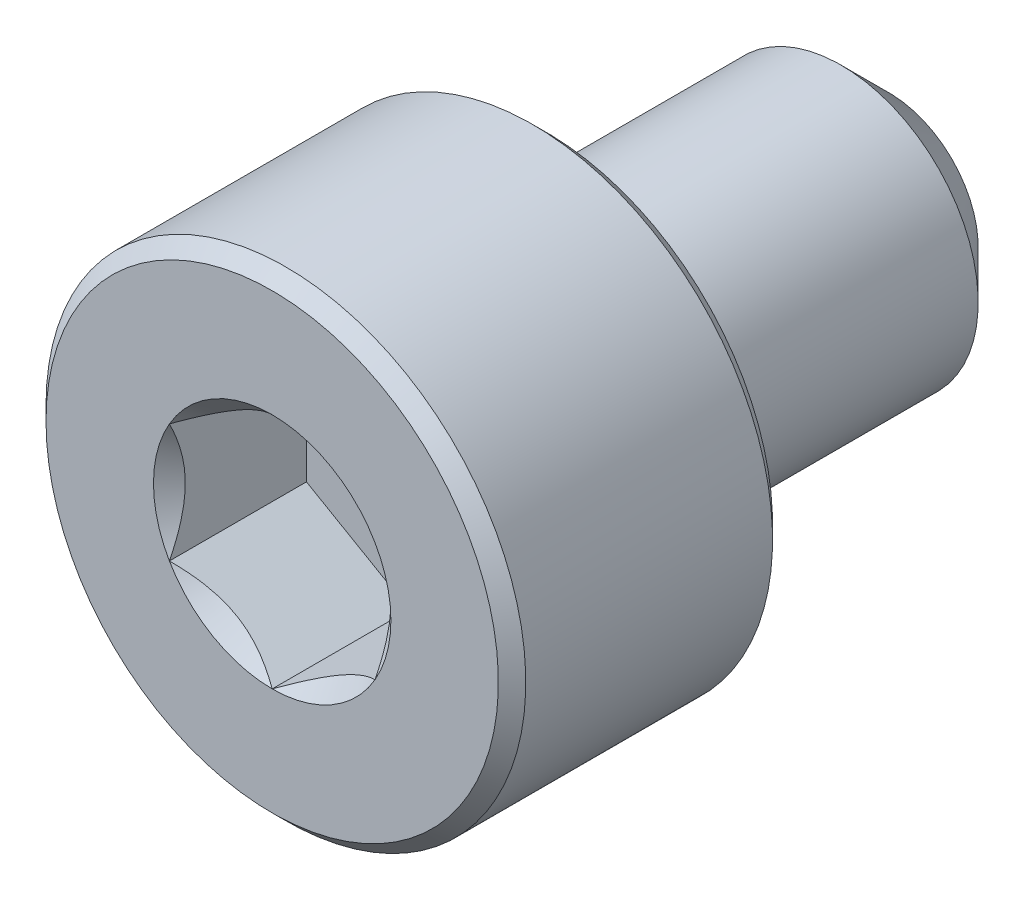
ISO-10303-21;
HEADER;
FILE_DESCRIPTION(('STEP AP214'),'2;1');
FILE_NAME('part.step','',(''),(''),'','','');
FILE_SCHEMA(('AUTOMOTIVE_DESIGN { 1 0 10303 214 1 1 1 1 }'));
ENDSEC;
DATA;
#1=APPLICATION_CONTEXT('core data for automotive mechanical design processes');
#2=APPLICATION_PROTOCOL_DEFINITION('international standard','automotive_design',2000,#1);
#3=PRODUCT_CONTEXT('',#1,'mechanical');
#4=PRODUCT('Part','Part','',(#3));
#5=PRODUCT_RELATED_PRODUCT_CATEGORY('part','',(#4));
#6=PRODUCT_DEFINITION_FORMATION('','',#4);
#7=PRODUCT_DEFINITION_CONTEXT('part definition',#1,'design');
#8=PRODUCT_DEFINITION('design','',#6,#7);
#9=PRODUCT_DEFINITION_SHAPE('','',#8);
#10=(LENGTH_UNIT() NAMED_UNIT(*) SI_UNIT(.MILLI.,.METRE.));
#11=(NAMED_UNIT(*) PLANE_ANGLE_UNIT() SI_UNIT($,.RADIAN.));
#12=(NAMED_UNIT(*) SI_UNIT($,.STERADIAN.) SOLID_ANGLE_UNIT());
#13=UNCERTAINTY_MEASURE_WITH_UNIT(LENGTH_MEASURE(1.E-05),#10,'distance_accuracy_value','');
#14=(GEOMETRIC_REPRESENTATION_CONTEXT(3) GLOBAL_UNCERTAINTY_ASSIGNED_CONTEXT((#13)) GLOBAL_UNIT_ASSIGNED_CONTEXT((#10,
#11,#12)) REPRESENTATION_CONTEXT('',''));
#15=CARTESIAN_POINT('',(0.,0.,0.));
#16=DIRECTION('',(0.,0.,1.));
#17=DIRECTION('',(1.,0.,0.));
#18=AXIS2_PLACEMENT_3D('',#15,#16,#17);
#19=CARTESIAN_POINT('',(0.,3.3,4.5));
#20=DIRECTION('',(0.,0.,1.));
#21=DIRECTION('',(1.,0.,0.));
#22=AXIS2_PLACEMENT_3D('',#19,#20,#21);
#23=PLANE('',#22);
#24=CARTESIAN_POINT('',(0.,0.,4.5));
#25=DIRECTION('',(0.,0.,1.));
#26=DIRECTION('',(1.,0.,0.));
#27=AXIS2_PLACEMENT_3D('',#24,#25,#26);
#28=CIRCLE('',#27,1.73205080756888);
#29=CARTESIAN_POINT('',(1.5,0.86602540378444,4.5));
#30=VERTEX_POINT('',#29);
#31=CARTESIAN_POINT('',(0.,1.73205080756888,4.5));
#32=VERTEX_POINT('',#31);
#33=EDGE_CURVE('E102',#30,#32,#28,.T.);
#34=ORIENTED_EDGE('',*,*,#33,.F.);
#35=CARTESIAN_POINT('',(1.5,-0.86602540378444,4.5));
#36=VERTEX_POINT('',#35);
#37=EDGE_CURVE('E62',#36,#30,#28,.T.);
#38=ORIENTED_EDGE('',*,*,#37,.F.);
#39=CARTESIAN_POINT('',(0.,-1.73205080756888,4.5));
#40=VERTEX_POINT('',#39);
#41=EDGE_CURVE('E288',#40,#36,#28,.T.);
#42=ORIENTED_EDGE('',*,*,#41,.F.);
#43=CARTESIAN_POINT('',(-1.5,-0.866025403784437,4.5));
#44=VERTEX_POINT('',#43);
#45=EDGE_CURVE('E69',#44,#40,#28,.T.);
#46=ORIENTED_EDGE('',*,*,#45,.F.);
#47=CARTESIAN_POINT('',(-1.5,0.86602540378444,4.5));
#48=VERTEX_POINT('',#47);
#49=EDGE_CURVE('E138',#48,#44,#28,.T.);
#50=ORIENTED_EDGE('',*,*,#49,.F.);
#51=EDGE_CURVE('E111',#32,#48,#28,.T.);
#52=ORIENTED_EDGE('',*,*,#51,.F.);
#53=EDGE_LOOP('',(#34,#38,#42,#46,#50,#52));
#54=FACE_BOUND('',#53,.T.);
#55=CARTESIAN_POINT('',(0.,0.,4.5));
#56=DIRECTION('',(0.,0.,-1.));
#57=DIRECTION('',(-1.,0.,0.));
#58=AXIS2_PLACEMENT_3D('',#55,#56,#57);
#59=CIRCLE('',#58,3.3);
#60=CARTESIAN_POINT('',(-3.3,0.,4.5));
#61=VERTEX_POINT('',#60);
#62=EDGE_CURVE('E56',#61,#61,#59,.T.);
#63=ORIENTED_EDGE('',*,*,#62,.F.);
#64=EDGE_LOOP('',(#63));
#65=FACE_BOUND('',#64,.T.);
#66=ADVANCED_FACE('F43',(#54,#65),#23,.T.);
#67=CARTESIAN_POINT('',(0.,0.,4.3));
#68=DIRECTION('',(0.,0.,-1.));
#69=DIRECTION('',(-1.,0.,0.));
#70=AXIS2_PLACEMENT_3D('',#67,#68,#69);
#71=CONICAL_SURFACE('',#70,3.5,0.785398163397452);
#72=ORIENTED_EDGE('',*,*,#62,.T.);
#73=EDGE_LOOP('',(#72));
#74=FACE_BOUND('',#73,.T.);
#75=CARTESIAN_POINT('',(0.,0.,4.3));
#76=DIRECTION('',(0.,0.,-1.));
#77=DIRECTION('',(-1.,0.,0.));
#78=AXIS2_PLACEMENT_3D('',#75,#76,#77);
#79=CIRCLE('',#78,3.5);
#80=CARTESIAN_POINT('',(-3.5,0.,4.3));
#81=VERTEX_POINT('',#80);
#82=EDGE_CURVE('E222',#81,#81,#79,.T.);
#83=ORIENTED_EDGE('',*,*,#82,.F.);
#84=EDGE_LOOP('',(#83));
#85=FACE_BOUND('',#84,.T.);
#86=ADVANCED_FACE('F227',(#74,#85),#71,.T.);
#87=CARTESIAN_POINT('',(0.,0.,-4.5));
#88=DIRECTION('',(0.,0.,-1.));
#89=DIRECTION('',(-1.,0.,0.));
#90=AXIS2_PLACEMENT_3D('',#87,#88,#89);
#91=CYLINDRICAL_SURFACE('',#90,3.5);
#92=ORIENTED_EDGE('',*,*,#82,.T.);
#93=EDGE_LOOP('',(#92));
#94=FACE_BOUND('',#93,.T.);
#95=CARTESIAN_POINT('',(0.,0.,0.700000000000001));
#96=DIRECTION('',(0.,0.,-1.));
#97=DIRECTION('',(-1.,0.,0.));
#98=AXIS2_PLACEMENT_3D('',#95,#96,#97);
#99=CIRCLE('',#98,3.5);
#100=CARTESIAN_POINT('',(-3.5,0.,0.700000000000001));
#101=VERTEX_POINT('',#100);
#102=EDGE_CURVE('E219',#101,#101,#99,.T.);
#103=ORIENTED_EDGE('',*,*,#102,.F.);
#104=EDGE_LOOP('',(#103));
#105=FACE_BOUND('',#104,.T.);
#106=ADVANCED_FACE('F235',(#94,#105),#91,.T.);
#107=CARTESIAN_POINT('',(0.,0.,0.5));
#108=DIRECTION('',(0.,0.,1.));
#109=DIRECTION('',(1.,0.,0.));
#110=AXIS2_PLACEMENT_3D('',#107,#108,#109);
#111=CONICAL_SURFACE('',#110,3.3,0.785398163397448);
#112=ORIENTED_EDGE('',*,*,#102,.T.);
#113=EDGE_LOOP('',(#112));
#114=FACE_BOUND('',#113,.T.);
#115=CARTESIAN_POINT('',(0.,0.,0.5));
#116=DIRECTION('',(0.,0.,-1.));
#117=DIRECTION('',(-1.,0.,0.));
#118=AXIS2_PLACEMENT_3D('',#115,#116,#117);
#119=CIRCLE('',#118,3.3);
#120=CARTESIAN_POINT('',(-3.3,0.,0.5));
#121=VERTEX_POINT('',#120);
#122=EDGE_CURVE('E216',#121,#121,#119,.T.);
#123=ORIENTED_EDGE('',*,*,#122,.F.);
#124=EDGE_LOOP('',(#123));
#125=FACE_BOUND('',#124,.T.);
#126=ADVANCED_FACE('F239',(#114,#125),#111,.T.);
#127=CARTESIAN_POINT('',(0.,3.3,0.5));
#128=DIRECTION('',(0.,0.,-1.));
#129=DIRECTION('',(-1.,0.,0.));
#130=AXIS2_PLACEMENT_3D('',#127,#128,#129);
#131=PLANE('',#130);
#132=ORIENTED_EDGE('',*,*,#122,.T.);
#133=EDGE_LOOP('',(#132));
#134=FACE_BOUND('',#133,.T.);
#135=CARTESIAN_POINT('',(0.,0.,0.5));
#136=DIRECTION('',(0.,0.,-1.));
#137=DIRECTION('',(-1.,0.,0.));
#138=AXIS2_PLACEMENT_3D('',#135,#136,#137);
#139=CIRCLE('',#138,2.);
#140=CARTESIAN_POINT('',(-2.,0.,0.5));
#141=VERTEX_POINT('',#140);
#142=EDGE_CURVE('E213',#141,#141,#139,.T.);
#143=ORIENTED_EDGE('',*,*,#142,.F.);
#144=EDGE_LOOP('',(#143));
#145=FACE_BOUND('',#144,.T.);
#146=ADVANCED_FACE('F245',(#134,#145),#131,.T.);
#147=CARTESIAN_POINT('',(0.,0.,-4.5));
#148=DIRECTION('',(0.,0.,-1.));
#149=DIRECTION('',(-1.,0.,0.));
#150=AXIS2_PLACEMENT_3D('',#147,#148,#149);
#151=CYLINDRICAL_SURFACE('',#150,2.);
#152=ORIENTED_EDGE('',*,*,#142,.T.);
#153=EDGE_LOOP('',(#152));
#154=FACE_BOUND('',#153,.T.);
#155=CARTESIAN_POINT('',(0.,0.,-3.79999999999999));
#156=DIRECTION('',(0.,0.,-1.));
#157=DIRECTION('',(-1.,0.,0.));
#158=AXIS2_PLACEMENT_3D('',#155,#156,#157);
#159=CIRCLE('',#158,2.);
#160=CARTESIAN_POINT('',(-2.,0.,-3.79999999999999));
#161=VERTEX_POINT('',#160);
#162=EDGE_CURVE('E210',#161,#161,#159,.T.);
#163=ORIENTED_EDGE('',*,*,#162,.F.);
#164=EDGE_LOOP('',(#163));
#165=FACE_BOUND('',#164,.T.);
#166=ADVANCED_FACE('F249',(#154,#165),#151,.T.);
#167=CARTESIAN_POINT('',(0.,0.,-4.5));
#168=DIRECTION('',(0.,0.,1.));
#169=DIRECTION('',(1.,0.,0.));
#170=AXIS2_PLACEMENT_3D('',#167,#168,#169);
#171=CONICAL_SURFACE('',#170,1.3,0.785398163397443);
#172=ORIENTED_EDGE('',*,*,#162,.T.);
#173=EDGE_LOOP('',(#172));
#174=FACE_BOUND('',#173,.T.);
#175=CARTESIAN_POINT('',(0.,0.,-4.5));
#176=DIRECTION('',(0.,0.,-1.));
#177=DIRECTION('',(-1.,0.,0.));
#178=AXIS2_PLACEMENT_3D('',#175,#176,#177);
#179=CIRCLE('',#178,1.3);
#180=CARTESIAN_POINT('',(-1.3,0.,-4.5));
#181=VERTEX_POINT('',#180);
#182=EDGE_CURVE('E198',#181,#181,#179,.T.);
#183=ORIENTED_EDGE('',*,*,#182,.F.);
#184=EDGE_LOOP('',(#183));
#185=FACE_BOUND('',#184,.T.);
#186=ADVANCED_FACE('F252',(#174,#185),#171,.T.);
#187=CARTESIAN_POINT('',(0.,1.3,-4.5));
#188=DIRECTION('',(0.,0.,-1.));
#189=DIRECTION('',(-1.,0.,0.));
#190=AXIS2_PLACEMENT_3D('',#187,#188,#189);
#191=PLANE('',#190);
#192=ORIENTED_EDGE('',*,*,#182,.T.);
#193=EDGE_LOOP('',(#192));
#194=FACE_BOUND('',#193,.T.);
#195=ADVANCED_FACE('F171',(#194),#191,.T.);
#196=CARTESIAN_POINT('',(0.,0.,4.5));
#197=DIRECTION('',(0.,0.,1.));
#198=DIRECTION('',(1.,0.,0.));
#199=AXIS2_PLACEMENT_3D('',#196,#197,#198);
#200=CONICAL_SURFACE('',#199,1.73205080756888,0.78539816339745);
#201=ORIENTED_EDGE('',*,*,#51,.T.);
#202=CARTESIAN_POINT('',(0.000200000000000415,1.73216627762272,4.50011548160007));
#203=CARTESIAN_POINT('',(-0.0513677907370752,1.70239359975915,4.47036547606733));
#204=CARTESIAN_POINT('',(-0.1037979176652,1.67212305186355,4.44236248391031));
#205=CARTESIAN_POINT('',(-0.210709034055596,1.61039789003619,4.39108923044014));
#206=CARTESIAN_POINT('',(-0.265200195814661,1.57893740312614,4.36784750504437));
#207=CARTESIAN_POINT('',(-0.375079081357248,1.51549879897987,4.32803372899222));
#208=CARTESIAN_POINT('',(-0.430438809095199,1.4835368452681,4.3113615856709));
#209=CARTESIAN_POINT('',(-0.54237725747715,1.41890915196211,4.2856744568181));
#210=CARTESIAN_POINT('',(-0.598952556553008,1.38624538781118,4.27664029047887));
#211=CARTESIAN_POINT('',(-0.69645538951644,1.329952100953,4.26848908122685));
#212=CARTESIAN_POINT('',(-0.737256908280466,1.30639533311124,4.26728225298922));
#213=CARTESIAN_POINT('',(-0.818787969615858,1.25932335290193,4.26931405716227));
#214=CARTESIAN_POINT('',(-0.85951749431463,1.23580815085313,4.27255367074831));
#215=CARTESIAN_POINT('',(-0.940584402163416,1.18900414978427,4.28329198598196));
#216=CARTESIAN_POINT('',(-0.980921384598288,1.1657155821172,4.29079465301873));
#217=CARTESIAN_POINT('',(-1.06091833691403,1.11952932016335,4.30965161192829));
#218=CARTESIAN_POINT('',(-1.10057800851621,1.09663179808786,4.32100755701859));
#219=CARTESIAN_POINT('',(-1.20216313477448,1.03798159809698,4.35472164759267));
#220=CARTESIAN_POINT('',(-1.26345855370969,1.00259267147465,4.37962184909337));
#221=CARTESIAN_POINT('',(-1.35358562846331,0.950557780604375,4.42165665327158));
#222=CARTESIAN_POINT('',(-1.38328513990772,0.933410759677148,4.4364251535591));
#223=CARTESIAN_POINT('',(-1.44213790138375,0.899432101996407,4.46731056594017));
#224=CARTESIAN_POINT('',(-1.47129140422064,0.88260031928571,4.48342683412171));
#225=CARTESIAN_POINT('',(-1.5002,0.865909933730601,4.50011548160007));
#226=B_SPLINE_CURVE_WITH_KNOTS('',3,(#202,#203,#204,#205,#206,#207,#208,#209,#210,#211,#212,
#213,#214,#215,#216,#217,#218,#219,#220,#221,#222,#223,#224,#225),.UNSPECIFIED.,.F.,.F.,(4,2,2,
2,2,2,2,2,2,2,2,4),(0.,0.199829143693305,0.400822987382389,0.598623720538181,0.795926240188889,
0.937113067959881,1.07833105577193,1.21968061668222,1.36109089931054,1.58570969637565,
1.69770705470964,1.80965120737194),.UNSPECIFIED.);
#227=EDGE_CURVE('E11',#32,#48,#226,.T.);
#228=ORIENTED_EDGE('',*,*,#227,.F.);
#229=EDGE_LOOP('',(#201,#228));
#230=FACE_BOUND('',#229,.T.);
#231=ADVANCED_FACE('F115',(#230),#200,.F.);
#232=ORIENTED_EDGE('',*,*,#49,.T.);
#233=CARTESIAN_POINT('',(-1.5,-1.70094076570699,5.03581150933748));
#234=CARTESIAN_POINT('',(-1.5,-1.65940339844307,5.00466245356307));
#235=CARTESIAN_POINT('',(-1.5,-1.61763176138548,4.97382664603814));
#236=CARTESIAN_POINT('',(-1.5,-1.53352581710889,4.91291005817041));
#237=CARTESIAN_POINT('',(-1.5,-1.49119136858461,4.88282947313436));
#238=CARTESIAN_POINT('',(-1.5,-1.36258344501966,4.79348482963313));
#239=CARTESIAN_POINT('',(-1.5,-1.27533705988673,4.73559781348778));
#240=CARTESIAN_POINT('',(-1.5,-1.09255216894207,4.62219567429685));
#241=CARTESIAN_POINT('',(-1.5,-0.996821581803492,4.56698654757307));
#242=CARTESIAN_POINT('',(-1.5,-0.800613082291591,4.4661637894456));
#243=CARTESIAN_POINT('',(-1.5,-0.700152604862087,4.42051785177961));
#244=CARTESIAN_POINT('',(-1.5,-0.549105960820994,4.36468252969871));
#245=CARTESIAN_POINT('',(-1.5,-0.50070074362804,4.34861439232622));
#246=CARTESIAN_POINT('',(-1.5,-0.40274469507941,4.32036772251469));
#247=CARTESIAN_POINT('',(-1.5,-0.353193782853662,4.30818946555124));
#248=CARTESIAN_POINT('',(-1.5,-0.254057869430008,4.28855091399036));
#249=CARTESIAN_POINT('',(-1.5,-0.204488814603775,4.28101136158588));
#250=CARTESIAN_POINT('',(-1.5,-0.104849462627796,4.27079321692886));
#251=CARTESIAN_POINT('',(-1.5,-0.054779247575758,4.26811384119743));
#252=CARTESIAN_POINT('',(-1.5,0.043673722908844,4.26780462686181));
#253=CARTESIAN_POINT('',(-1.5,0.0920560164094804,4.27000633072589));
#254=CARTESIAN_POINT('',(-1.5,0.188397733218518,4.27897258823616));
#255=CARTESIAN_POINT('',(-1.5,0.236357072029982,4.28573803359405));
#256=CARTESIAN_POINT('',(-1.5,0.332310053939587,4.30358163901288));
#257=CARTESIAN_POINT('',(-1.5,0.380290051019947,4.31473209678684));
#258=CARTESIAN_POINT('',(-1.5,0.475204866701384,4.34076106187732));
#259=CARTESIAN_POINT('',(-1.5,0.52213978119671,4.35563922560084));
#260=CARTESIAN_POINT('',(-1.5,0.671135849237721,4.40843439268167));
#261=CARTESIAN_POINT('',(-1.5,0.771043708402958,4.45241449643641));
#262=CARTESIAN_POINT('',(-1.5,0.96615432077171,4.55016194816059));
#263=CARTESIAN_POINT('',(-1.5,1.06133841027248,4.60396471049644));
#264=CARTESIAN_POINT('',(-1.5,1.24322962123133,4.71492426634355));
#265=CARTESIAN_POINT('',(-1.5,1.33012275327054,4.77177988846287));
#266=CARTESIAN_POINT('',(-1.5,1.45814294533514,4.85965573982338));
#267=CARTESIAN_POINT('',(-1.5,1.50026316125082,4.88925424362582));
#268=CARTESIAN_POINT('',(-1.5,1.58392901779071,4.94922957252824));
#269=CARTESIAN_POINT('',(-1.5,1.62547481197907,4.97960618316485));
#270=CARTESIAN_POINT('',(-1.5,1.66678158585385,5.01030528702036));
#271=B_SPLINE_CURVE_WITH_KNOTS('',3,(#233,#234,#235,#236,#237,#238,#239,#240,#241,#242,#243,
#244,#245,#246,#247,#248,#249,#250,#251,#252,#253,#254,#255,#256,#257,#258,#259,#260,#261,#262,
#263,#264,#265,#266,#267,#268,#269,#270),.UNSPECIFIED.,.F.,.F.,(4,2,2,2,2,2,2,2,2,2,2,2,2,2,2,2,
2,2,4),(0.,0.155753948201002,0.311547769199354,0.625513832410582,0.956763614654479,
1.28687565594417,1.43975300144579,1.59264117109685,1.74283872260253,1.89301205954152,
2.03808349452257,2.1831832832956,2.33078307442231,2.47836926586908,2.80488410158813,
3.13260026706957,3.44396956433299,3.59840353500356,3.75279538879849),.UNSPECIFIED.);
#272=EDGE_CURVE('E110',#48,#44,#271,.F.);
#273=ORIENTED_EDGE('',*,*,#272,.F.);
#274=EDGE_LOOP('',(#232,#273));
#275=FACE_BOUND('',#274,.T.);
#276=ADVANCED_FACE('F266',(#275),#200,.F.);
#277=ORIENTED_EDGE('',*,*,#45,.T.);
#278=CARTESIAN_POINT('',(-1.5002,-0.865909933730601,4.50011548160007));
#279=CARTESIAN_POINT('',(-1.44863220926292,-0.895682611594166,4.47036547606733));
#280=CARTESIAN_POINT('',(-1.3962020823348,-0.925953159489765,4.44236248391031));
#281=CARTESIAN_POINT('',(-1.2892909659444,-0.987678321317124,4.39108923044014));
#282=CARTESIAN_POINT('',(-1.23479980418534,-1.01913880822717,4.36784750504437));
#283=CARTESIAN_POINT('',(-1.12492091864275,-1.08257741237344,4.32803372899222));
#284=CARTESIAN_POINT('',(-1.0695611909048,-1.11453936608521,4.3113615856709));
#285=CARTESIAN_POINT('',(-0.95762274252285,-1.1791670593912,4.2856744568181));
#286=CARTESIAN_POINT('',(-0.901047443446992,-1.21183082354213,4.27664029047887));
#287=CARTESIAN_POINT('',(-0.80354461048356,-1.26812411040032,4.26848908122685));
#288=CARTESIAN_POINT('',(-0.762743091719535,-1.29168087824208,4.26728225298922));
#289=CARTESIAN_POINT('',(-0.681212030384143,-1.33875285845138,4.26931405716227));
#290=CARTESIAN_POINT('',(-0.640482505685371,-1.36226806050018,4.27255367074831));
#291=CARTESIAN_POINT('',(-0.559415597836585,-1.40907206156905,4.28329198598196));
#292=CARTESIAN_POINT('',(-0.519078615401713,-1.43236062923612,4.29079465301873));
#293=CARTESIAN_POINT('',(-0.439081663085971,-1.47854689118996,4.30965161192829));
#294=CARTESIAN_POINT('',(-0.399421991483793,-1.50144441326545,4.32100755701859));
#295=CARTESIAN_POINT('',(-0.297836865225516,-1.56009461325633,4.35472164759267));
#296=CARTESIAN_POINT('',(-0.236541446290312,-1.59548353987866,4.37962184909337));
#297=CARTESIAN_POINT('',(-0.146414371536687,-1.64751843074894,4.42165665327158));
#298=CARTESIAN_POINT('',(-0.116714860092283,-1.66466545167617,4.4364251535591));
#299=CARTESIAN_POINT('',(-0.0578620986162492,-1.69864410935691,4.46731056594017));
#300=CARTESIAN_POINT('',(-0.028708595779363,-1.71547589206761,4.48342683412171));
#301=CARTESIAN_POINT('',(0.000199999999999664,-1.73216627762272,4.50011548160007));
#302=B_SPLINE_CURVE_WITH_KNOTS('',3,(#278,#279,#280,#281,#282,#283,#284,#285,#286,#287,#288,
#289,#290,#291,#292,#293,#294,#295,#296,#297,#298,#299,#300,#301),.UNSPECIFIED.,.F.,.F.,(4,2,2,
2,2,2,2,2,2,2,2,4),(0.,0.199829143693305,0.400822987382389,0.59862372053818,0.795926240188889,
0.93711306795988,1.07833105577193,1.21968061668222,1.36109089931054,1.58570969637565,
1.69770705470964,1.80965120737194),.UNSPECIFIED.);
#303=EDGE_CURVE('E147',#44,#40,#302,.T.);
#304=ORIENTED_EDGE('',*,*,#303,.F.);
#305=EDGE_LOOP('',(#277,#304));
#306=FACE_BOUND('',#305,.T.);
#307=ADVANCED_FACE('F270',(#306),#200,.F.);
#308=ORIENTED_EDGE('',*,*,#41,.T.);
#309=CARTESIAN_POINT('',(-0.000200000000000533,-1.73216627762272,4.50011548160007));
#310=CARTESIAN_POINT('',(0.0513677907370751,-1.70239359975915,4.47036547606733));
#311=CARTESIAN_POINT('',(0.1037979176652,-1.67212305186355,4.44236248391031));
#312=CARTESIAN_POINT('',(0.210709034055596,-1.61039789003619,4.39108923044014));
#313=CARTESIAN_POINT('',(0.265200195814661,-1.57893740312614,4.36784750504437));
#314=CARTESIAN_POINT('',(0.375079081357248,-1.51549879897987,4.32803372899222));
#315=CARTESIAN_POINT('',(0.430438809095199,-1.4835368452681,4.3113615856709));
#316=CARTESIAN_POINT('',(0.54237725747715,-1.41890915196211,4.2856744568181));
#317=CARTESIAN_POINT('',(0.598952556553008,-1.38624538781118,4.27664029047887));
#318=CARTESIAN_POINT('',(0.696455389516441,-1.329952100953,4.26848908122685));
#319=CARTESIAN_POINT('',(0.737256908280466,-1.30639533311124,4.26728225298922));
#320=CARTESIAN_POINT('',(0.818787969615858,-1.25932335290193,4.26931405716227));
#321=CARTESIAN_POINT('',(0.85951749431463,-1.23580815085313,4.27255367074831));
#322=CARTESIAN_POINT('',(0.940584402163416,-1.18900414978427,4.28329198598196));
#323=CARTESIAN_POINT('',(0.980921384598288,-1.1657155821172,4.29079465301873));
#324=CARTESIAN_POINT('',(1.06091833691403,-1.11952932016335,4.30965161192829));
#325=CARTESIAN_POINT('',(1.10057800851621,-1.09663179808786,4.32100755701859));
#326=CARTESIAN_POINT('',(1.20216313477448,-1.03798159809698,4.35472164759267));
#327=CARTESIAN_POINT('',(1.26345855370969,-1.00259267147465,4.37962184909337));
#328=CARTESIAN_POINT('',(1.35358562846331,-0.950557780604375,4.42165665327158));
#329=CARTESIAN_POINT('',(1.38328513990772,-0.933410759677148,4.4364251535591));
#330=CARTESIAN_POINT('',(1.44213790138375,-0.899432101996408,4.46731056594017));
#331=CARTESIAN_POINT('',(1.47129140422064,-0.882600319285711,4.48342683412171));
#332=CARTESIAN_POINT('',(1.5002,-0.865909933730602,4.50011548160007));
#333=B_SPLINE_CURVE_WITH_KNOTS('',3,(#309,#310,#311,#312,#313,#314,#315,#316,#317,#318,#319,
#320,#321,#322,#323,#324,#325,#326,#327,#328,#329,#330,#331,#332),.UNSPECIFIED.,.F.,.F.,(4,2,2,
2,2,2,2,2,2,2,2,4),(0.,0.199829143693305,0.400822987382389,0.598623720538181,0.79592624018889,
0.937113067959882,1.07833105577193,1.21968061668222,1.36109089931054,1.58570969637565,
1.69770705470964,1.80965120737194),.UNSPECIFIED.);
#334=EDGE_CURVE('E290',#40,#36,#333,.T.);
#335=ORIENTED_EDGE('',*,*,#334,.F.);
#336=EDGE_LOOP('',(#308,#335));
#337=FACE_BOUND('',#336,.T.);
#338=ADVANCED_FACE('F278',(#337),#200,.F.);
#339=ORIENTED_EDGE('',*,*,#37,.T.);
#340=CARTESIAN_POINT('',(1.5,-1.70094076506827,5.03581150885843));
#341=CARTESIAN_POINT('',(1.5,-1.65940339782208,5.00466245310244));
#342=CARTESIAN_POINT('',(1.5,-1.61763176078228,4.97382664559589));
#343=CARTESIAN_POINT('',(1.5,-1.53352581654146,4.91291005776482));
#344=CARTESIAN_POINT('',(1.5,-1.49119136803515,4.88282947274705));
#345=CARTESIAN_POINT('',(1.5,-1.36258344452521,4.79348482930099));
#346=CARTESIAN_POINT('',(1.5,-1.2753370594297,4.73559781319227));
#347=CARTESIAN_POINT('',(1.5,-1.09255216856664,4.6221956740766));
#348=CARTESIAN_POINT('',(1.5,-0.996821581472455,4.56698654739118));
#349=CARTESIAN_POINT('',(1.5,-0.800613082053126,4.46616378933479));
#350=CARTESIAN_POINT('',(1.5,-0.70015260467177,4.42051785170157));
#351=CARTESIAN_POINT('',(1.5,-0.549105960667007,4.36468252964533));
#352=CARTESIAN_POINT('',(1.5,-0.500700743459033,4.3486143922722));
#353=CARTESIAN_POINT('',(1.5,-0.402744694879906,4.32036772246244));
#354=CARTESIAN_POINT('',(1.5,-0.353193782638679,4.30818946550141));
#355=CARTESIAN_POINT('',(1.5,-0.254057869184595,4.28855091394885));
#356=CARTESIAN_POINT('',(1.5,-0.204488814343416,4.28101136155019));
#357=CARTESIAN_POINT('',(1.5,-0.104849462338082,4.27079321690814));
#358=CARTESIAN_POINT('',(1.5,-0.0547792472716355,4.26811384118586));
#359=CARTESIAN_POINT('',(1.5,0.043673723240303,4.26780462687103));
#360=CARTESIAN_POINT('',(1.5,0.0920560167539032,4.27000633074664));
#361=CARTESIAN_POINT('',(1.5,0.188397733587633,4.27897258828183));
#362=CARTESIAN_POINT('',(1.5,0.236357072410824,4.28573803365309));
#363=CARTESIAN_POINT('',(1.5,0.332310054343575,4.30358163910001));
#364=CARTESIAN_POINT('',(1.5,0.380290051435318,4.31473209688875));
#365=CARTESIAN_POINT('',(1.5,0.475204867138458,4.34076106200917));
#366=CARTESIAN_POINT('',(1.5,0.522139781644104,4.35563922574786));
#367=CARTESIAN_POINT('',(1.5,0.671135849783409,4.40843439290061));
#368=CARTESIAN_POINT('',(1.5,0.77104370903169,4.4524144967216));
#369=CARTESIAN_POINT('',(1.5,0.966154321560161,4.55016194858557));
#370=CARTESIAN_POINT('',(1.5,1.06133841113756,4.603964710995));
#371=CARTESIAN_POINT('',(1.5,1.24322962223427,4.71492426698296));
#372=CARTESIAN_POINT('',(1.5,1.33012275433518,4.7717798891689));
#373=CARTESIAN_POINT('',(1.5,1.45814294649102,4.85965574062901));
#374=CARTESIAN_POINT('',(1.5,1.50026316243668,4.88925424446438));
#375=CARTESIAN_POINT('',(1.5,1.58392901903632,4.94922957343262));
#376=CARTESIAN_POINT('',(1.5,1.62547481325447,4.97960618410212));
#377=CARTESIAN_POINT('',(1.5,1.66678158715899,5.01030528799048));
#378=B_SPLINE_CURVE_WITH_KNOTS('',3,(#340,#341,#342,#343,#344,#345,#346,#347,#348,#349,#350,
#351,#352,#353,#354,#355,#356,#357,#358,#359,#360,#361,#362,#363,#364,#365,#366,#367,#368,#369,
#370,#371,#372,#373,#374,#375,#376,#377),.UNSPECIFIED.,.F.,.F.,(4,2,2,2,2,2,2,2,2,2,2,2,2,2,2,2,
2,2,4),(0.,0.155753948125308,0.311547769047944,0.625513832104916,0.956763614176022,
1.28687565529455,1.43975300083938,1.59264117053358,1.74283872208071,1.89301205906115,
2.03808349408246,2.18318328289586,2.33078307406584,2.47836926555587,2.80488410158167,
3.1326002673719,3.44396956489969,3.59840353570064,3.75279538962596),.UNSPECIFIED.);
#379=EDGE_CURVE('E127',#36,#30,#378,.T.);
#380=ORIENTED_EDGE('',*,*,#379,.F.);
#381=EDGE_LOOP('',(#339,#380));
#382=FACE_BOUND('',#381,.T.);
#383=ADVANCED_FACE('F273',(#382),#200,.F.);
#384=ORIENTED_EDGE('',*,*,#33,.T.);
#385=CARTESIAN_POINT('',(1.5002,0.865909933730602,4.50011548160007));
#386=CARTESIAN_POINT('',(1.44863220926292,0.895682611594167,4.47036547606733));
#387=CARTESIAN_POINT('',(1.3962020823348,0.925953159489766,4.44236248391031));
#388=CARTESIAN_POINT('',(1.2892909659444,0.987678321317125,4.39108923044014));
#389=CARTESIAN_POINT('',(1.23479980418534,1.01913880822718,4.36784750504437));
#390=CARTESIAN_POINT('',(1.12492091864275,1.08257741237344,4.32803372899222));
#391=CARTESIAN_POINT('',(1.0695611909048,1.11453936608522,4.3113615856709));
#392=CARTESIAN_POINT('',(0.957622742522849,1.1791670593912,4.2856744568181));
#393=CARTESIAN_POINT('',(0.901047443446991,1.21183082354213,4.27664029047887));
#394=CARTESIAN_POINT('',(0.803544610483559,1.26812411040032,4.26848908122685));
#395=CARTESIAN_POINT('',(0.762743091719533,1.29168087824208,4.26728225298922));
#396=CARTESIAN_POINT('',(0.681212030384141,1.33875285845138,4.26931405716227));
#397=CARTESIAN_POINT('',(0.64048250568537,1.36226806050018,4.27255367074831));
#398=CARTESIAN_POINT('',(0.559415597836584,1.40907206156905,4.28329198598196));
#399=CARTESIAN_POINT('',(0.519078615401712,1.43236062923612,4.29079465301873));
#400=CARTESIAN_POINT('',(0.439081663085969,1.47854689118997,4.30965161192829));
#401=CARTESIAN_POINT('',(0.399421991483792,1.50144441326545,4.32100755701859));
#402=CARTESIAN_POINT('',(0.297836865225515,1.56009461325633,4.35472164759267));
#403=CARTESIAN_POINT('',(0.236541446290311,1.59548353987866,4.37962184909337));
#404=CARTESIAN_POINT('',(0.146414371536686,1.64751843074894,4.42165665327158));
#405=CARTESIAN_POINT('',(0.116714860092282,1.66466545167617,4.4364251535591));
#406=CARTESIAN_POINT('',(0.057862098616249,1.69864410935691,4.46731056594017));
#407=CARTESIAN_POINT('',(0.0287085957793628,1.71547589206761,4.48342683412171));
#408=CARTESIAN_POINT('',(-0.000199999999999924,1.73216627762272,4.50011548160007));
#409=B_SPLINE_CURVE_WITH_KNOTS('',3,(#385,#386,#387,#388,#389,#390,#391,#392,#393,#394,#395,
#396,#397,#398,#399,#400,#401,#402,#403,#404,#405,#406,#407,#408),.UNSPECIFIED.,.F.,.F.,(4,2,2,
2,2,2,2,2,2,2,2,4),(0.,0.199829143693305,0.400822987382388,0.59862372053818,0.795926240188888,
0.93711306795988,1.07833105577193,1.21968061668222,1.36109089931054,1.58570969637565,
1.69770705470963,1.80965120737194),.UNSPECIFIED.);
#410=EDGE_CURVE('E106',#30,#32,#409,.T.);
#411=ORIENTED_EDGE('',*,*,#410,.F.);
#412=EDGE_LOOP('',(#384,#411));
#413=FACE_BOUND('',#412,.T.);
#414=ADVANCED_FACE('F104',(#413),#200,.F.);
#415=CARTESIAN_POINT('',(0.,0.,2.5));
#416=DIRECTION('',(0.,0.,1.));
#417=DIRECTION('',(1.,0.,0.));
#418=AXIS2_PLACEMENT_3D('',#415,#416,#417);
#419=PLANE('',#418);
#420=DIRECTION('',(-0.866025403784439,0.5,0.));
#421=VECTOR('',#420,1.);
#422=CARTESIAN_POINT('',(1.5,0.86602540378444,2.5));
#423=LINE('',#422,#421);
#424=CARTESIAN_POINT('',(1.5,0.86602540378444,2.5));
#425=VERTEX_POINT('',#424);
#426=CARTESIAN_POINT('',(0.,1.73205080756888,2.5));
#427=VERTEX_POINT('',#426);
#428=EDGE_CURVE('E126',#425,#427,#423,.T.);
#429=ORIENTED_EDGE('',*,*,#428,.T.);
#430=DIRECTION('',(-0.866025403784439,-0.5,0.));
#431=VECTOR('',#430,1.);
#432=CARTESIAN_POINT('',(0.,1.73205080756888,2.5));
#433=LINE('',#432,#431);
#434=CARTESIAN_POINT('',(-1.5,0.866025403784439,2.5));
#435=VERTEX_POINT('',#434);
#436=EDGE_CURVE('E131',#427,#435,#433,.T.);
#437=ORIENTED_EDGE('',*,*,#436,.T.);
#438=DIRECTION('',(0.,-1.,0.));
#439=VECTOR('',#438,1.);
#440=CARTESIAN_POINT('',(-1.5,0.866025403784439,2.5));
#441=LINE('',#440,#439);
#442=CARTESIAN_POINT('',(-1.5,-0.866025403784439,2.5));
#443=VERTEX_POINT('',#442);
#444=EDGE_CURVE('E186',#435,#443,#441,.T.);
#445=ORIENTED_EDGE('',*,*,#444,.T.);
#446=DIRECTION('',(0.866025403784439,-0.5,0.));
#447=VECTOR('',#446,1.);
#448=CARTESIAN_POINT('',(-1.5,-0.866025403784439,2.5));
#449=LINE('',#448,#447);
#450=CARTESIAN_POINT('',(0.,-1.73205080756888,2.5));
#451=VERTEX_POINT('',#450);
#452=EDGE_CURVE('E189',#443,#451,#449,.T.);
#453=ORIENTED_EDGE('',*,*,#452,.T.);
#454=DIRECTION('',(0.866025403784439,0.5,0.));
#455=VECTOR('',#454,1.);
#456=CARTESIAN_POINT('',(0.,-1.73205080756888,2.5));
#457=LINE('',#456,#455);
#458=CARTESIAN_POINT('',(1.5,-0.86602540378444,2.5));
#459=VERTEX_POINT('',#458);
#460=EDGE_CURVE('E192',#451,#459,#457,.T.);
#461=ORIENTED_EDGE('',*,*,#460,.T.);
#462=DIRECTION('',(0.,1.,0.));
#463=VECTOR('',#462,1.);
#464=CARTESIAN_POINT('',(1.5,-0.86602540378444,2.5));
#465=LINE('',#464,#463);
#466=EDGE_CURVE('E134',#459,#425,#465,.T.);
#467=ORIENTED_EDGE('',*,*,#466,.T.);
#468=EDGE_LOOP('',(#429,#437,#445,#453,#461,#467));
#469=FACE_BOUND('',#468,.T.);
#470=ADVANCED_FACE('F166',(#469),#419,.T.);
#471=CARTESIAN_POINT('',(0.,1.73205080756888,2.5));
#472=DIRECTION('',(-0.5,0.866025403784439,0.));
#473=DIRECTION('',(-0.866025403784439,-0.5,0.));
#474=AXIS2_PLACEMENT_3D('',#471,#472,#473);
#475=PLANE('',#474);
#476=DIRECTION('',(0.,0.,1.));
#477=VECTOR('',#476,1.);
#478=CARTESIAN_POINT('',(0.,1.73205080756888,2.5));
#479=LINE('',#478,#477);
#480=EDGE_CURVE('E123',#427,#32,#479,.T.);
#481=ORIENTED_EDGE('',*,*,#480,.T.);
#482=ORIENTED_EDGE('',*,*,#227,.T.);
#483=DIRECTION('',(0.,0.,1.));
#484=VECTOR('',#483,1.);
#485=CARTESIAN_POINT('',(-1.5,0.866025403784439,2.5));
#486=LINE('',#485,#484);
#487=EDGE_CURVE('E133',#435,#48,#486,.T.);
#488=ORIENTED_EDGE('',*,*,#487,.F.);
#489=ORIENTED_EDGE('',*,*,#436,.F.);
#490=EDGE_LOOP('',(#481,#482,#488,#489));
#491=FACE_BOUND('',#490,.T.);
#492=ADVANCED_FACE('F129',(#491),#475,.F.);
#493=CARTESIAN_POINT('',(-1.5,0.866025403784439,2.5));
#494=DIRECTION('',(-1.,0.,0.));
#495=DIRECTION('',(0.,-1.,0.));
#496=AXIS2_PLACEMENT_3D('',#493,#494,#495);
#497=PLANE('',#496);
#498=ORIENTED_EDGE('',*,*,#487,.T.);
#499=ORIENTED_EDGE('',*,*,#272,.T.);
#500=DIRECTION('',(0.,0.,1.));
#501=VECTOR('',#500,1.);
#502=CARTESIAN_POINT('',(-1.5,-0.866025403784439,2.5));
#503=LINE('',#502,#501);
#504=EDGE_CURVE('E204',#443,#44,#503,.T.);
#505=ORIENTED_EDGE('',*,*,#504,.F.);
#506=ORIENTED_EDGE('',*,*,#444,.F.);
#507=EDGE_LOOP('',(#498,#499,#505,#506));
#508=FACE_BOUND('',#507,.T.);
#509=ADVANCED_FACE('F156',(#508),#497,.F.);
#510=CARTESIAN_POINT('',(-1.5,-0.866025403784439,2.5));
#511=DIRECTION('',(-0.5,-0.866025403784439,0.));
#512=DIRECTION('',(0.866025403784439,-0.5,0.));
#513=AXIS2_PLACEMENT_3D('',#510,#511,#512);
#514=PLANE('',#513);
#515=ORIENTED_EDGE('',*,*,#504,.T.);
#516=ORIENTED_EDGE('',*,*,#303,.T.);
#517=DIRECTION('',(0.,0.,1.));
#518=VECTOR('',#517,1.);
#519=CARTESIAN_POINT('',(0.,-1.73205080756888,2.5));
#520=LINE('',#519,#518);
#521=EDGE_CURVE('E201',#451,#40,#520,.T.);
#522=ORIENTED_EDGE('',*,*,#521,.F.);
#523=ORIENTED_EDGE('',*,*,#452,.F.);
#524=EDGE_LOOP('',(#515,#516,#522,#523));
#525=FACE_BOUND('',#524,.T.);
#526=ADVANCED_FACE('F159',(#525),#514,.F.);
#527=CARTESIAN_POINT('',(0.,-1.73205080756888,2.5));
#528=DIRECTION('',(0.5,-0.866025403784439,0.));
#529=DIRECTION('',(0.866025403784439,0.5,0.));
#530=AXIS2_PLACEMENT_3D('',#527,#528,#529);
#531=PLANE('',#530);
#532=ORIENTED_EDGE('',*,*,#521,.T.);
#533=ORIENTED_EDGE('',*,*,#334,.T.);
#534=DIRECTION('',(0.,0.,1.));
#535=VECTOR('',#534,1.);
#536=CARTESIAN_POINT('',(1.5,-0.86602540378444,2.5));
#537=LINE('',#536,#535);
#538=EDGE_CURVE('E199',#459,#36,#537,.T.);
#539=ORIENTED_EDGE('',*,*,#538,.F.);
#540=ORIENTED_EDGE('',*,*,#460,.F.);
#541=EDGE_LOOP('',(#532,#533,#539,#540));
#542=FACE_BOUND('',#541,.T.);
#543=ADVANCED_FACE('F296',(#542),#531,.F.);
#544=CARTESIAN_POINT('',(1.5,-0.86602540378444,2.5));
#545=DIRECTION('',(1.,0.,0.));
#546=DIRECTION('',(0.,0.,-1.));
#547=AXIS2_PLACEMENT_3D('',#544,#545,#546);
#548=PLANE('',#547);
#549=ORIENTED_EDGE('',*,*,#538,.T.);
#550=ORIENTED_EDGE('',*,*,#379,.T.);
#551=DIRECTION('',(0.,0.,1.));
#552=VECTOR('',#551,1.);
#553=CARTESIAN_POINT('',(1.5,0.86602540378444,2.5));
#554=LINE('',#553,#552);
#555=EDGE_CURVE('E125',#425,#30,#554,.T.);
#556=ORIENTED_EDGE('',*,*,#555,.F.);
#557=ORIENTED_EDGE('',*,*,#466,.F.);
#558=EDGE_LOOP('',(#549,#550,#556,#557));
#559=FACE_BOUND('',#558,.T.);
#560=ADVANCED_FACE('F170',(#559),#548,.F.);
#561=CARTESIAN_POINT('',(1.5,0.86602540378444,2.5));
#562=DIRECTION('',(0.5,0.866025403784439,0.));
#563=DIRECTION('',(-0.866025403784439,0.5,0.));
#564=AXIS2_PLACEMENT_3D('',#561,#562,#563);
#565=PLANE('',#564);
#566=ORIENTED_EDGE('',*,*,#555,.T.);
#567=ORIENTED_EDGE('',*,*,#410,.T.);
#568=ORIENTED_EDGE('',*,*,#480,.F.);
#569=ORIENTED_EDGE('',*,*,#428,.F.);
#570=EDGE_LOOP('',(#566,#567,#568,#569));
#571=FACE_BOUND('',#570,.T.);
#572=ADVANCED_FACE('F121',(#571),#565,.F.);
#573=CLOSED_SHELL('',(#66,#86,#106,#126,#146,#166,#186,#195,#231,#276,#307,#338,#383,#414,#470,
#492,#509,#526,#543,#560,#572));
#574=MANIFOLD_SOLID_BREP('B2',#573);
#575=ADVANCED_BREP_SHAPE_REPRESENTATION('',(#18,#574),#14);
#576=SHAPE_DEFINITION_REPRESENTATION(#9,#575);
ENDSEC;
END-ISO-10303-21;
